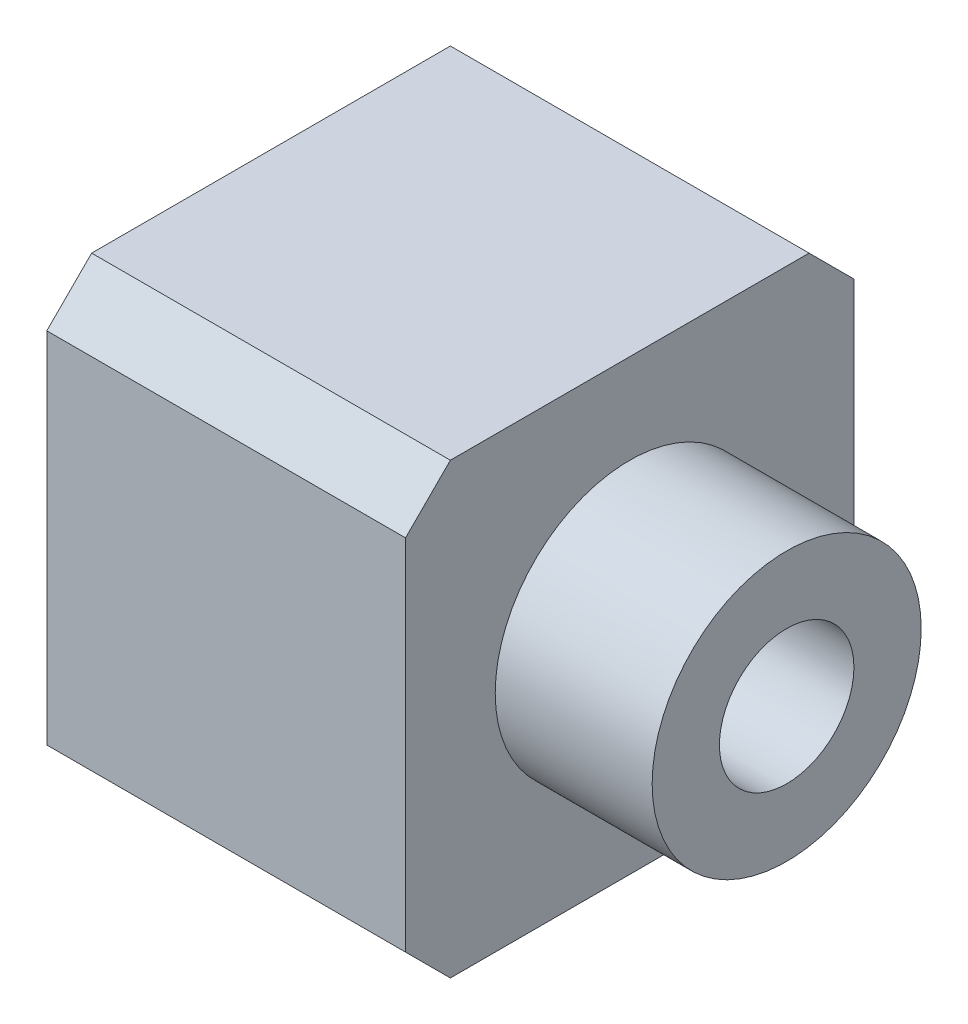
ISO-10303-21;
HEADER;
FILE_DESCRIPTION(('STEP AP214'),'2;1');
FILE_NAME('part.step','',(''),(''),'','','');
FILE_SCHEMA(('AUTOMOTIVE_DESIGN { 1 0 10303 214 1 1 1 1 }'));
ENDSEC;
DATA;
#1=APPLICATION_CONTEXT('core data for automotive mechanical design processes');
#2=APPLICATION_PROTOCOL_DEFINITION('international standard','automotive_design',2000,#1);
#3=PRODUCT_CONTEXT('',#1,'mechanical');
#4=PRODUCT('Part','Part','',(#3));
#5=PRODUCT_RELATED_PRODUCT_CATEGORY('part','',(#4));
#6=PRODUCT_DEFINITION_FORMATION('','',#4);
#7=PRODUCT_DEFINITION_CONTEXT('part definition',#1,'design');
#8=PRODUCT_DEFINITION('design','',#6,#7);
#9=PRODUCT_DEFINITION_SHAPE('','',#8);
#10=(LENGTH_UNIT() NAMED_UNIT(*) SI_UNIT(.MILLI.,.METRE.));
#11=(NAMED_UNIT(*) PLANE_ANGLE_UNIT() SI_UNIT($,.RADIAN.));
#12=(NAMED_UNIT(*) SI_UNIT($,.STERADIAN.) SOLID_ANGLE_UNIT());
#13=UNCERTAINTY_MEASURE_WITH_UNIT(LENGTH_MEASURE(1.E-05),#10,'distance_accuracy_value','');
#14=(GEOMETRIC_REPRESENTATION_CONTEXT(3) GLOBAL_UNCERTAINTY_ASSIGNED_CONTEXT((#13)) GLOBAL_UNIT_ASSIGNED_CONTEXT((#10,
#11,#12)) REPRESENTATION_CONTEXT('',''));
#15=CARTESIAN_POINT('',(0.,0.,0.));
#16=DIRECTION('',(0.,0.,1.));
#17=DIRECTION('',(1.,0.,0.));
#18=AXIS2_PLACEMENT_3D('',#15,#16,#17);
#19=CARTESIAN_POINT('',(-13.5,-5.,5.));
#20=DIRECTION('',(0.,0.,1.));
#21=DIRECTION('',(1.,0.,0.));
#22=AXIS2_PLACEMENT_3D('',#19,#20,#21);
#23=PLANE('',#22);
#24=DIRECTION('',(0.,1.,0.));
#25=VECTOR('',#24,1.);
#26=CARTESIAN_POINT('',(-3.5,-5.,5.));
#27=LINE('',#26,#25);
#28=CARTESIAN_POINT('',(-3.5,-4.,5.));
#29=VERTEX_POINT('',#28);
#30=CARTESIAN_POINT('',(-3.5,4.,5.));
#31=VERTEX_POINT('',#30);
#32=EDGE_CURVE('E132',#29,#31,#27,.T.);
#33=ORIENTED_EDGE('',*,*,#32,.T.);
#34=DIRECTION('',(-1.,0.,0.));
#35=VECTOR('',#34,1.);
#36=CARTESIAN_POINT('',(-13.5,4.,5.));
#37=LINE('',#36,#35);
#38=CARTESIAN_POINT('',(-11.5,4.,5.));
#39=VERTEX_POINT('',#38);
#40=EDGE_CURVE('E11',#31,#39,#37,.T.);
#41=ORIENTED_EDGE('',*,*,#40,.T.);
#42=DIRECTION('',(0.,-1.,0.));
#43=VECTOR('',#42,1.);
#44=CARTESIAN_POINT('',(-11.5,-5.,5.));
#45=LINE('',#44,#43);
#46=CARTESIAN_POINT('',(-11.5,-4.,5.));
#47=VERTEX_POINT('',#46);
#48=EDGE_CURVE('E133',#39,#47,#45,.T.);
#49=ORIENTED_EDGE('',*,*,#48,.T.);
#50=DIRECTION('',(1.,0.,0.));
#51=VECTOR('',#50,1.);
#52=CARTESIAN_POINT('',(-13.5,-4.,5.));
#53=LINE('',#52,#51);
#54=EDGE_CURVE('E41',#47,#29,#53,.T.);
#55=ORIENTED_EDGE('',*,*,#54,.T.);
#56=EDGE_LOOP('',(#33,#41,#49,#55));
#57=FACE_BOUND('',#56,.T.);
#58=ADVANCED_FACE('F33',(#57),#23,.T.);
#59=CARTESIAN_POINT('',(-13.5,5.,-5.));
#60=DIRECTION('',(0.,1.,0.));
#61=DIRECTION('',(0.,0.,1.));
#62=AXIS2_PLACEMENT_3D('',#59,#60,#61);
#63=PLANE('',#62);
#64=DIRECTION('',(0.,0.,1.));
#65=VECTOR('',#64,1.);
#66=CARTESIAN_POINT('',(-11.5,5.,-5.));
#67=LINE('',#66,#65);
#68=CARTESIAN_POINT('',(-11.5,5.,-4.));
#69=VERTEX_POINT('',#68);
#70=CARTESIAN_POINT('',(-11.5,5.,4.));
#71=VERTEX_POINT('',#70);
#72=EDGE_CURVE('E168',#69,#71,#67,.T.);
#73=ORIENTED_EDGE('',*,*,#72,.T.);
#74=DIRECTION('',(1.,0.,0.));
#75=VECTOR('',#74,1.);
#76=CARTESIAN_POINT('',(-13.5,5.,4.));
#77=LINE('',#76,#75);
#78=CARTESIAN_POINT('',(-3.5,5.,4.));
#79=VERTEX_POINT('',#78);
#80=EDGE_CURVE('E129',#71,#79,#77,.T.);
#81=ORIENTED_EDGE('',*,*,#80,.T.);
#82=DIRECTION('',(0.,0.,-1.));
#83=VECTOR('',#82,1.);
#84=CARTESIAN_POINT('',(-3.5,5.,-5.));
#85=LINE('',#84,#83);
#86=CARTESIAN_POINT('',(-3.5,5.,-4.));
#87=VERTEX_POINT('',#86);
#88=EDGE_CURVE('E140',#79,#87,#85,.T.);
#89=ORIENTED_EDGE('',*,*,#88,.T.);
#90=DIRECTION('',(-1.,0.,0.));
#91=VECTOR('',#90,1.);
#92=CARTESIAN_POINT('',(-13.5,5.,-4.));
#93=LINE('',#92,#91);
#94=EDGE_CURVE('E127',#87,#69,#93,.T.);
#95=ORIENTED_EDGE('',*,*,#94,.T.);
#96=EDGE_LOOP('',(#73,#81,#89,#95));
#97=FACE_BOUND('',#96,.T.);
#98=ADVANCED_FACE('F209',(#97),#63,.T.);
#99=CARTESIAN_POINT('',(-13.5,-5.,-5.));
#100=DIRECTION('',(0.,0.,-1.));
#101=DIRECTION('',(-1.,0.,0.));
#102=AXIS2_PLACEMENT_3D('',#99,#100,#101);
#103=PLANE('',#102);
#104=CARTESIAN_POINT('',(-7.5,0.,-5.));
#105=DIRECTION('',(0.,0.,-1.));
#106=DIRECTION('',(-1.,0.,0.));
#107=AXIS2_PLACEMENT_3D('',#104,#105,#106);
#108=CIRCLE('',#107,1.5);
#109=CARTESIAN_POINT('',(-9.,0.,-5.));
#110=VERTEX_POINT('',#109);
#111=EDGE_CURVE('E194',#110,#110,#108,.T.);
#112=ORIENTED_EDGE('',*,*,#111,.F.);
#113=EDGE_LOOP('',(#112));
#114=FACE_BOUND('',#113,.T.);
#115=DIRECTION('',(0.,-1.,0.));
#116=VECTOR('',#115,1.);
#117=CARTESIAN_POINT('',(-3.5,-5.,-5.));
#118=LINE('',#117,#116);
#119=CARTESIAN_POINT('',(-3.5,4.,-5.));
#120=VERTEX_POINT('',#119);
#121=CARTESIAN_POINT('',(-3.5,-3.99999999999999,-5.));
#122=VERTEX_POINT('',#121);
#123=EDGE_CURVE('E144',#120,#122,#118,.T.);
#124=ORIENTED_EDGE('',*,*,#123,.T.);
#125=DIRECTION('',(-1.,0.,0.));
#126=VECTOR('',#125,1.);
#127=CARTESIAN_POINT('',(-13.5,-3.99999999999999,-5.));
#128=LINE('',#127,#126);
#129=CARTESIAN_POINT('',(-11.5,-3.99999999999999,-5.));
#130=VERTEX_POINT('',#129);
#131=EDGE_CURVE('E122',#122,#130,#128,.T.);
#132=ORIENTED_EDGE('',*,*,#131,.T.);
#133=DIRECTION('',(0.,1.,0.));
#134=VECTOR('',#133,1.);
#135=CARTESIAN_POINT('',(-11.5,-5.,-5.));
#136=LINE('',#135,#134);
#137=CARTESIAN_POINT('',(-11.5,4.,-5.));
#138=VERTEX_POINT('',#137);
#139=EDGE_CURVE('E162',#130,#138,#136,.T.);
#140=ORIENTED_EDGE('',*,*,#139,.T.);
#141=DIRECTION('',(1.,0.,0.));
#142=VECTOR('',#141,1.);
#143=CARTESIAN_POINT('',(-13.5,4.,-5.));
#144=LINE('',#143,#142);
#145=EDGE_CURVE('E155',#138,#120,#144,.T.);
#146=ORIENTED_EDGE('',*,*,#145,.T.);
#147=EDGE_LOOP('',(#124,#132,#140,#146));
#148=FACE_BOUND('',#147,.T.);
#149=ADVANCED_FACE('F161',(#114,#148),#103,.T.);
#150=CARTESIAN_POINT('',(-13.5,-5.,-5.));
#151=DIRECTION('',(0.,-1.,0.));
#152=DIRECTION('',(0.,0.,-1.));
#153=AXIS2_PLACEMENT_3D('',#150,#151,#152);
#154=PLANE('',#153);
#155=DIRECTION('',(0.,0.,-1.));
#156=VECTOR('',#155,1.);
#157=CARTESIAN_POINT('',(-11.5,-5.,-5.));
#158=LINE('',#157,#156);
#159=CARTESIAN_POINT('',(-11.5,-5.,4.));
#160=VERTEX_POINT('',#159);
#161=CARTESIAN_POINT('',(-11.5,-5.,-4.));
#162=VERTEX_POINT('',#161);
#163=EDGE_CURVE('E102',#160,#162,#158,.T.);
#164=ORIENTED_EDGE('',*,*,#163,.T.);
#165=DIRECTION('',(1.,0.,0.));
#166=VECTOR('',#165,1.);
#167=CARTESIAN_POINT('',(-13.5,-5.,-4.));
#168=LINE('',#167,#166);
#169=CARTESIAN_POINT('',(-3.5,-5.,-4.));
#170=VERTEX_POINT('',#169);
#171=EDGE_CURVE('E107',#162,#170,#168,.T.);
#172=ORIENTED_EDGE('',*,*,#171,.T.);
#173=DIRECTION('',(0.,0.,1.));
#174=VECTOR('',#173,1.);
#175=CARTESIAN_POINT('',(-3.5,-5.,-5.));
#176=LINE('',#175,#174);
#177=CARTESIAN_POINT('',(-3.5,-5.,4.));
#178=VERTEX_POINT('',#177);
#179=EDGE_CURVE('E105',#170,#178,#176,.T.);
#180=ORIENTED_EDGE('',*,*,#179,.T.);
#181=DIRECTION('',(-1.,0.,0.));
#182=VECTOR('',#181,1.);
#183=CARTESIAN_POINT('',(-13.5,-5.,4.));
#184=LINE('',#183,#182);
#185=EDGE_CURVE('E99',#178,#160,#184,.T.);
#186=ORIENTED_EDGE('',*,*,#185,.T.);
#187=EDGE_LOOP('',(#164,#172,#180,#186));
#188=FACE_BOUND('',#187,.T.);
#189=ADVANCED_FACE('F100',(#188),#154,.T.);
#190=CARTESIAN_POINT('',(-3.5,0.,0.));
#191=DIRECTION('',(1.,0.,0.));
#192=DIRECTION('',(0.,0.,-1.));
#193=AXIS2_PLACEMENT_3D('',#190,#191,#192);
#194=PLANE('',#193);
#195=ORIENTED_EDGE('',*,*,#179,.F.);
#196=DIRECTION('',(0.,-0.707106781186548,0.707106781186547));
#197=VECTOR('',#196,1.);
#198=CARTESIAN_POINT('',(-3.5,-4.49999999999999,-4.5));
#199=LINE('',#198,#197);
#200=EDGE_CURVE('E153',#170,#122,#199,.F.);
#201=ORIENTED_EDGE('',*,*,#200,.T.);
#202=ORIENTED_EDGE('',*,*,#123,.F.);
#203=DIRECTION('',(0.,-0.707106781186547,-0.707106781186548));
#204=VECTOR('',#203,1.);
#205=CARTESIAN_POINT('',(-3.5,4.50000000000001,-4.49999999999999));
#206=LINE('',#205,#204);
#207=EDGE_CURVE('E149',#120,#87,#206,.F.);
#208=ORIENTED_EDGE('',*,*,#207,.T.);
#209=ORIENTED_EDGE('',*,*,#88,.F.);
#210=DIRECTION('',(0.,0.707106781186549,-0.707106781186546));
#211=VECTOR('',#210,1.);
#212=CARTESIAN_POINT('',(-3.5,4.49999999999999,4.50000000000001));
#213=LINE('',#212,#211);
#214=EDGE_CURVE('E139',#79,#31,#213,.F.);
#215=ORIENTED_EDGE('',*,*,#214,.T.);
#216=ORIENTED_EDGE('',*,*,#32,.F.);
#217=DIRECTION('',(0.,0.707106781186547,0.707106781186548));
#218=VECTOR('',#217,1.);
#219=CARTESIAN_POINT('',(-3.5,-4.5,4.5));
#220=LINE('',#219,#218);
#221=EDGE_CURVE('E137',#29,#178,#220,.F.);
#222=ORIENTED_EDGE('',*,*,#221,.T.);
#223=EDGE_LOOP('',(#195,#201,#202,#208,#209,#215,#216,#222));
#224=FACE_BOUND('',#223,.T.);
#225=CARTESIAN_POINT('',(-3.5,0.,0.));
#226=DIRECTION('',(1.,0.,0.));
#227=DIRECTION('',(0.,0.,-1.));
#228=AXIS2_PLACEMENT_3D('',#225,#226,#227);
#229=CIRCLE('',#228,3.);
#230=CARTESIAN_POINT('',(-3.5,0.,-3.));
#231=VERTEX_POINT('',#230);
#232=EDGE_CURVE('E172',#231,#231,#229,.T.);
#233=ORIENTED_EDGE('',*,*,#232,.F.);
#234=EDGE_LOOP('',(#233));
#235=FACE_BOUND('',#234,.T.);
#236=ADVANCED_FACE('F135',(#224,#235),#194,.T.);
#237=CARTESIAN_POINT('',(-3.5,0.,0.));
#238=DIRECTION('',(1.,0.,0.));
#239=DIRECTION('',(0.,0.,-1.));
#240=AXIS2_PLACEMENT_3D('',#237,#238,#239);
#241=CYLINDRICAL_SURFACE('',#240,3.);
#242=ORIENTED_EDGE('',*,*,#232,.T.);
#243=EDGE_LOOP('',(#242));
#244=FACE_BOUND('',#243,.T.);
#245=CARTESIAN_POINT('',(0.,0.,0.));
#246=DIRECTION('',(1.,0.,0.));
#247=DIRECTION('',(0.,0.,-1.));
#248=AXIS2_PLACEMENT_3D('',#245,#246,#247);
#249=CIRCLE('',#248,3.);
#250=CARTESIAN_POINT('',(0.,0.,-3.));
#251=VERTEX_POINT('',#250);
#252=EDGE_CURVE('E174',#251,#251,#249,.T.);
#253=ORIENTED_EDGE('',*,*,#252,.F.);
#254=EDGE_LOOP('',(#253));
#255=FACE_BOUND('',#254,.T.);
#256=ADVANCED_FACE('F327',(#244,#255),#241,.T.);
#257=CARTESIAN_POINT('',(0.,0.,0.));
#258=DIRECTION('',(1.,0.,0.));
#259=DIRECTION('',(0.,0.,-1.));
#260=AXIS2_PLACEMENT_3D('',#257,#258,#259);
#261=PLANE('',#260);
#262=CARTESIAN_POINT('',(0.,0.,0.));
#263=DIRECTION('',(1.,0.,0.));
#264=DIRECTION('',(0.,0.,-1.));
#265=AXIS2_PLACEMENT_3D('',#262,#263,#264);
#266=CIRCLE('',#265,1.5);
#267=CARTESIAN_POINT('',(0.,0.,-1.5));
#268=VERTEX_POINT('',#267);
#269=EDGE_CURVE('E188',#268,#268,#266,.T.);
#270=ORIENTED_EDGE('',*,*,#269,.F.);
#271=EDGE_LOOP('',(#270));
#272=FACE_BOUND('',#271,.T.);
#273=ORIENTED_EDGE('',*,*,#252,.T.);
#274=EDGE_LOOP('',(#273));
#275=FACE_BOUND('',#274,.T.);
#276=ADVANCED_FACE('F298',(#272,#275),#261,.T.);
#277=CARTESIAN_POINT('',(-11.5,0.,0.));
#278=DIRECTION('',(-1.,0.,0.));
#279=DIRECTION('',(0.,0.,1.));
#280=AXIS2_PLACEMENT_3D('',#277,#278,#279);
#281=PLANE('',#280);
#282=ORIENTED_EDGE('',*,*,#139,.F.);
#283=DIRECTION('',(0.,0.707106781186548,-0.707106781186547));
#284=VECTOR('',#283,1.);
#285=CARTESIAN_POINT('',(-11.5,-4.49999999999999,-4.5));
#286=LINE('',#285,#284);
#287=EDGE_CURVE('E113',#130,#162,#286,.F.);
#288=ORIENTED_EDGE('',*,*,#287,.T.);
#289=ORIENTED_EDGE('',*,*,#163,.F.);
#290=DIRECTION('',(0.,-0.707106781186547,-0.707106781186548));
#291=VECTOR('',#290,1.);
#292=CARTESIAN_POINT('',(-11.5,-4.5,4.5));
#293=LINE('',#292,#291);
#294=EDGE_CURVE('E48',#160,#47,#293,.F.);
#295=ORIENTED_EDGE('',*,*,#294,.T.);
#296=ORIENTED_EDGE('',*,*,#48,.F.);
#297=DIRECTION('',(0.,-0.707106781186549,0.707106781186546));
#298=VECTOR('',#297,1.);
#299=CARTESIAN_POINT('',(-11.5,4.49999999999999,4.50000000000001));
#300=LINE('',#299,#298);
#301=EDGE_CURVE('E118',#39,#71,#300,.F.);
#302=ORIENTED_EDGE('',*,*,#301,.T.);
#303=ORIENTED_EDGE('',*,*,#72,.F.);
#304=DIRECTION('',(0.,0.707106781186547,0.707106781186548));
#305=VECTOR('',#304,1.);
#306=CARTESIAN_POINT('',(-11.5,4.50000000000001,-4.49999999999999));
#307=LINE('',#306,#305);
#308=EDGE_CURVE('E119',#69,#138,#307,.F.);
#309=ORIENTED_EDGE('',*,*,#308,.T.);
#310=EDGE_LOOP('',(#282,#288,#289,#295,#296,#302,#303,#309));
#311=FACE_BOUND('',#310,.T.);
#312=CARTESIAN_POINT('',(-11.5,0.,0.));
#313=DIRECTION('',(-1.,0.,0.));
#314=DIRECTION('',(0.,0.,1.));
#315=AXIS2_PLACEMENT_3D('',#312,#313,#314);
#316=CIRCLE('',#315,3.);
#317=CARTESIAN_POINT('',(-11.5,0.,3.));
#318=VERTEX_POINT('',#317);
#319=EDGE_CURVE('E169',#318,#318,#316,.T.);
#320=ORIENTED_EDGE('',*,*,#319,.F.);
#321=EDGE_LOOP('',(#320));
#322=FACE_BOUND('',#321,.T.);
#323=ADVANCED_FACE('F110',(#311,#322),#281,.T.);
#324=CARTESIAN_POINT('',(-11.5,0.,0.));
#325=DIRECTION('',(-1.,0.,0.));
#326=DIRECTION('',(0.,0.,1.));
#327=AXIS2_PLACEMENT_3D('',#324,#325,#326);
#328=CYLINDRICAL_SURFACE('',#327,3.);
#329=ORIENTED_EDGE('',*,*,#319,.T.);
#330=EDGE_LOOP('',(#329));
#331=FACE_BOUND('',#330,.T.);
#332=CARTESIAN_POINT('',(-13.5,0.,0.));
#333=DIRECTION('',(-1.,0.,0.));
#334=DIRECTION('',(0.,0.,1.));
#335=AXIS2_PLACEMENT_3D('',#332,#333,#334);
#336=CIRCLE('',#335,3.);
#337=CARTESIAN_POINT('',(-13.5,0.,3.));
#338=VERTEX_POINT('',#337);
#339=EDGE_CURVE('E182',#338,#338,#336,.T.);
#340=ORIENTED_EDGE('',*,*,#339,.F.);
#341=EDGE_LOOP('',(#340));
#342=FACE_BOUND('',#341,.T.);
#343=ADVANCED_FACE('F283',(#331,#342),#328,.T.);
#344=CARTESIAN_POINT('',(-13.5,0.,0.));
#345=DIRECTION('',(1.,0.,0.));
#346=DIRECTION('',(0.,0.,-1.));
#347=AXIS2_PLACEMENT_3D('',#344,#345,#346);
#348=PLANE('',#347);
#349=CARTESIAN_POINT('',(-13.5,0.,0.));
#350=DIRECTION('',(1.,0.,0.));
#351=DIRECTION('',(0.,0.,-1.));
#352=AXIS2_PLACEMENT_3D('',#349,#350,#351);
#353=CIRCLE('',#352,1.5);
#354=CARTESIAN_POINT('',(-13.5,0.,-1.5));
#355=VERTEX_POINT('',#354);
#356=EDGE_CURVE('E185',#355,#355,#353,.T.);
#357=ORIENTED_EDGE('',*,*,#356,.T.);
#358=EDGE_LOOP('',(#357));
#359=FACE_BOUND('',#358,.T.);
#360=ORIENTED_EDGE('',*,*,#339,.T.);
#361=EDGE_LOOP('',(#360));
#362=FACE_BOUND('',#361,.T.);
#363=ADVANCED_FACE('F278',(#359,#362),#348,.F.);
#364=CARTESIAN_POINT('',(-13.5,0.,0.));
#365=DIRECTION('',(1.,0.,0.));
#366=DIRECTION('',(0.,0.,-1.));
#367=AXIS2_PLACEMENT_3D('',#364,#365,#366);
#368=CYLINDRICAL_SURFACE('',#367,1.5);
#369=ORIENTED_EDGE('',*,*,#356,.F.);
#370=EDGE_LOOP('',(#369));
#371=FACE_BOUND('',#370,.T.);
#372=ORIENTED_EDGE('',*,*,#269,.T.);
#373=EDGE_LOOP('',(#372));
#374=FACE_BOUND('',#373,.T.);
#375=ADVANCED_FACE('F226',(#371,#374),#368,.F.);
#376=CARTESIAN_POINT('',(-13.5,-5.,-4.));
#377=DIRECTION('',(0.,0.707106781186547,0.707106781186548));
#378=DIRECTION('',(1.,0.,0.));
#379=AXIS2_PLACEMENT_3D('',#376,#377,#378);
#380=PLANE('',#379);
#381=ORIENTED_EDGE('',*,*,#287,.F.);
#382=ORIENTED_EDGE('',*,*,#131,.F.);
#383=ORIENTED_EDGE('',*,*,#200,.F.);
#384=ORIENTED_EDGE('',*,*,#171,.F.);
#385=EDGE_LOOP('',(#381,#382,#383,#384));
#386=FACE_BOUND('',#385,.T.);
#387=ADVANCED_FACE('F171',(#386),#380,.F.);
#388=CARTESIAN_POINT('',(-13.5,5.,4.));
#389=DIRECTION('',(0.,-0.707106781186546,-0.707106781186549));
#390=DIRECTION('',(1.,0.,0.));
#391=AXIS2_PLACEMENT_3D('',#388,#389,#390);
#392=PLANE('',#391);
#393=ORIENTED_EDGE('',*,*,#301,.F.);
#394=ORIENTED_EDGE('',*,*,#40,.F.);
#395=ORIENTED_EDGE('',*,*,#214,.F.);
#396=ORIENTED_EDGE('',*,*,#80,.F.);
#397=EDGE_LOOP('',(#393,#394,#395,#396));
#398=FACE_BOUND('',#397,.T.);
#399=ADVANCED_FACE('F225',(#398),#392,.F.);
#400=CARTESIAN_POINT('',(-13.5,-4.,5.));
#401=DIRECTION('',(0.,0.707106781186548,-0.707106781186547));
#402=DIRECTION('',(1.,0.,0.));
#403=AXIS2_PLACEMENT_3D('',#400,#401,#402);
#404=PLANE('',#403);
#405=ORIENTED_EDGE('',*,*,#294,.F.);
#406=ORIENTED_EDGE('',*,*,#185,.F.);
#407=ORIENTED_EDGE('',*,*,#221,.F.);
#408=ORIENTED_EDGE('',*,*,#54,.F.);
#409=EDGE_LOOP('',(#405,#406,#407,#408));
#410=FACE_BOUND('',#409,.T.);
#411=ADVANCED_FACE('F116',(#410),#404,.F.);
#412=CARTESIAN_POINT('',(-13.5,4.,-5.));
#413=DIRECTION('',(0.,-0.707106781186548,0.707106781186547));
#414=DIRECTION('',(1.,0.,0.));
#415=AXIS2_PLACEMENT_3D('',#412,#413,#414);
#416=PLANE('',#415);
#417=ORIENTED_EDGE('',*,*,#308,.F.);
#418=ORIENTED_EDGE('',*,*,#94,.F.);
#419=ORIENTED_EDGE('',*,*,#207,.F.);
#420=ORIENTED_EDGE('',*,*,#145,.F.);
#421=EDGE_LOOP('',(#417,#418,#419,#420));
#422=FACE_BOUND('',#421,.T.);
#423=ADVANCED_FACE('F35',(#422),#416,.F.);
#424=CARTESIAN_POINT('',(-7.5,0.,-3.));
#425=DIRECTION('',(0.,0.,-1.));
#426=DIRECTION('',(-1.,0.,0.));
#427=AXIS2_PLACEMENT_3D('',#424,#425,#426);
#428=CYLINDRICAL_SURFACE('',#427,1.5);
#429=CARTESIAN_POINT('',(-7.5,0.,-3.));
#430=DIRECTION('',(0.,0.,-1.));
#431=DIRECTION('',(-1.,0.,0.));
#432=AXIS2_PLACEMENT_3D('',#429,#430,#431);
#433=CIRCLE('',#432,1.5);
#434=CARTESIAN_POINT('',(-9.,0.,-3.));
#435=VERTEX_POINT('',#434);
#436=EDGE_CURVE('E191',#435,#435,#433,.T.);
#437=ORIENTED_EDGE('',*,*,#436,.F.);
#438=EDGE_LOOP('',(#437));
#439=FACE_BOUND('',#438,.T.);
#440=ORIENTED_EDGE('',*,*,#111,.T.);
#441=EDGE_LOOP('',(#440));
#442=FACE_BOUND('',#441,.T.);
#443=ADVANCED_FACE('F202',(#439,#442),#428,.F.);
#444=CARTESIAN_POINT('',(-7.5,0.,-3.));
#445=DIRECTION('',(0.,0.,-1.));
#446=DIRECTION('',(-1.,0.,0.));
#447=AXIS2_PLACEMENT_3D('',#444,#445,#446);
#448=PLANE('',#447);
#449=ORIENTED_EDGE('',*,*,#436,.T.);
#450=EDGE_LOOP('',(#449));
#451=FACE_BOUND('',#450,.T.);
#452=ADVANCED_FACE('F200',(#451),#448,.T.);
#453=CLOSED_SHELL('',(#58,#98,#149,#189,#236,#256,#276,#323,#343,#363,#375,#387,#399,#411,#423,
#443,#452));
#454=MANIFOLD_SOLID_BREP('B2',#453);
#455=ADVANCED_BREP_SHAPE_REPRESENTATION('',(#18,#454),#14);
#456=SHAPE_DEFINITION_REPRESENTATION(#9,#455);
ENDSEC;
END-ISO-10303-21;
